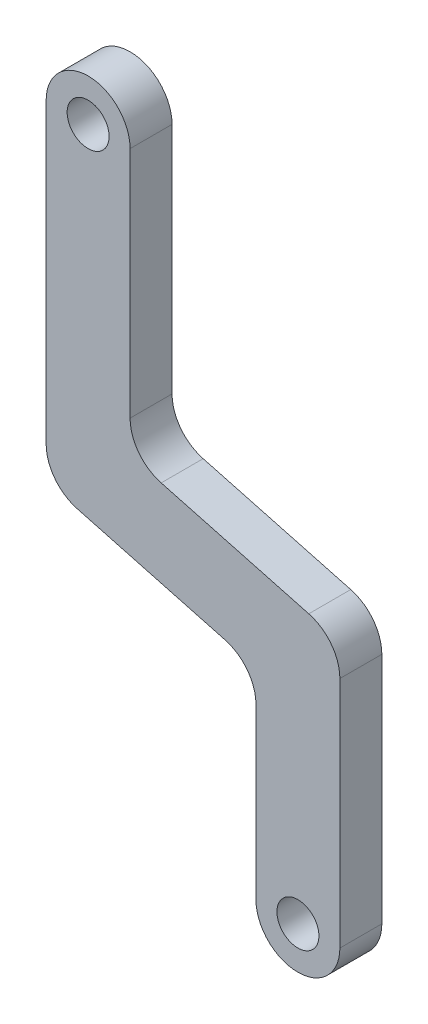
ISO-10303-21;
HEADER;
FILE_DESCRIPTION(('STEP AP214'),'2;1');
FILE_NAME('part.step','',(''),(''),'','','');
FILE_SCHEMA(('AUTOMOTIVE_DESIGN { 1 0 10303 214 1 1 1 1 }'));
ENDSEC;
DATA;
#1=APPLICATION_CONTEXT('core data for automotive mechanical design processes');
#2=APPLICATION_PROTOCOL_DEFINITION('international standard','automotive_design',2000,#1);
#3=PRODUCT_CONTEXT('',#1,'mechanical');
#4=PRODUCT('Part','Part','',(#3));
#5=PRODUCT_RELATED_PRODUCT_CATEGORY('part','',(#4));
#6=PRODUCT_DEFINITION_FORMATION('','',#4);
#7=PRODUCT_DEFINITION_CONTEXT('part definition',#1,'design');
#8=PRODUCT_DEFINITION('design','',#6,#7);
#9=PRODUCT_DEFINITION_SHAPE('','',#8);
#10=(LENGTH_UNIT() NAMED_UNIT(*) SI_UNIT(.MILLI.,.METRE.));
#11=(NAMED_UNIT(*) PLANE_ANGLE_UNIT() SI_UNIT($,.RADIAN.));
#12=(NAMED_UNIT(*) SI_UNIT($,.STERADIAN.) SOLID_ANGLE_UNIT());
#13=UNCERTAINTY_MEASURE_WITH_UNIT(LENGTH_MEASURE(1.E-05),#10,'distance_accuracy_value','');
#14=(GEOMETRIC_REPRESENTATION_CONTEXT(3) GLOBAL_UNCERTAINTY_ASSIGNED_CONTEXT((#13)) GLOBAL_UNIT_ASSIGNED_CONTEXT((#10,
#11,#12)) REPRESENTATION_CONTEXT('',''));
#15=CARTESIAN_POINT('',(0.,0.,0.));
#16=DIRECTION('',(0.,0.,1.));
#17=DIRECTION('',(1.,0.,0.));
#18=AXIS2_PLACEMENT_3D('',#15,#16,#17);
#19=CARTESIAN_POINT('',(-17.5,0.,5.));
#20=DIRECTION('',(-1.,0.,0.));
#21=DIRECTION('',(0.,-1.,0.));
#22=AXIS2_PLACEMENT_3D('',#19,#20,#21);
#23=PLANE('',#22);
#24=DIRECTION('',(0.,1.,0.));
#25=VECTOR('',#24,1.);
#26=CARTESIAN_POINT('',(-17.5,0.,0.));
#27=LINE('',#26,#25);
#28=CARTESIAN_POINT('',(-17.5,35.,0.));
#29=VERTEX_POINT('',#28);
#30=CARTESIAN_POINT('',(-17.5,-0.48727003450576,0.));
#31=VERTEX_POINT('',#30);
#32=EDGE_CURVE('E190',#29,#31,#27,.F.);
#33=ORIENTED_EDGE('',*,*,#32,.T.);
#34=DIRECTION('',(0.,0.,1.));
#35=VECTOR('',#34,1.);
#36=CARTESIAN_POINT('',(-17.5,-0.48727003450576,5.));
#37=LINE('',#36,#35);
#38=CARTESIAN_POINT('',(-17.5,-0.48727003450576,5.));
#39=VERTEX_POINT('',#38);
#40=EDGE_CURVE('E211',#31,#39,#37,.T.);
#41=ORIENTED_EDGE('',*,*,#40,.T.);
#42=DIRECTION('',(0.,-1.,0.));
#43=VECTOR('',#42,1.);
#44=CARTESIAN_POINT('',(-17.5,0.,5.));
#45=LINE('',#44,#43);
#46=CARTESIAN_POINT('',(-17.5,35.,5.));
#47=VERTEX_POINT('',#46);
#48=EDGE_CURVE('E154',#47,#39,#45,.T.);
#49=ORIENTED_EDGE('',*,*,#48,.F.);
#50=DIRECTION('',(0.,0.,1.));
#51=VECTOR('',#50,1.);
#52=CARTESIAN_POINT('',(-17.5,35.,5.));
#53=LINE('',#52,#51);
#54=EDGE_CURVE('E153',#29,#47,#53,.T.);
#55=ORIENTED_EDGE('',*,*,#54,.F.);
#56=EDGE_LOOP('',(#33,#41,#49,#55));
#57=FACE_BOUND('',#56,.T.);
#58=ADVANCED_FACE('F38',(#57),#23,.T.);
#59=CARTESIAN_POINT('',(-2.25325396048631,-8.40925826289068,5.));
#60=DIRECTION('',(-0.258819045102521,-0.965925826289068,0.));
#61=DIRECTION('',(0.965925826289068,-0.258819045102521,0.));
#62=AXIS2_PLACEMENT_3D('',#59,#60,#61);
#63=PLANE('',#62);
#64=DIRECTION('',(0.965925826289068,-0.258819045102521,0.));
#65=VECTOR('',#64,1.);
#66=CARTESIAN_POINT('',(-2.25325396048631,-8.40925826289068,0.));
#67=LINE('',#66,#65);
#68=CARTESIAN_POINT('',(-13.7940952255126,-5.3168991659511,0.));
#69=VERTEX_POINT('',#68);
#70=CARTESIAN_POINT('',(3.79409522551261,-10.0296405936281,0.));
#71=VERTEX_POINT('',#70);
#72=EDGE_CURVE('E187',#69,#71,#67,.T.);
#73=ORIENTED_EDGE('',*,*,#72,.T.);
#74=DIRECTION('',(0.,0.,1.));
#75=VECTOR('',#74,1.);
#76=CARTESIAN_POINT('',(3.7940952255126,-10.0296405936281,5.));
#77=LINE('',#76,#75);
#78=CARTESIAN_POINT('',(3.79409522551261,-10.0296405936281,5.));
#79=VERTEX_POINT('',#78);
#80=EDGE_CURVE('E206',#71,#79,#77,.T.);
#81=ORIENTED_EDGE('',*,*,#80,.T.);
#82=DIRECTION('',(0.965925826289068,-0.258819045102521,0.));
#83=VECTOR('',#82,1.);
#84=CARTESIAN_POINT('',(-2.25325396048631,-8.40925826289068,5.));
#85=LINE('',#84,#83);
#86=CARTESIAN_POINT('',(-13.7940952255126,-5.3168991659511,5.));
#87=VERTEX_POINT('',#86);
#88=EDGE_CURVE('E156',#87,#79,#85,.T.);
#89=ORIENTED_EDGE('',*,*,#88,.F.);
#90=DIRECTION('',(0.,0.,1.));
#91=VECTOR('',#90,1.);
#92=CARTESIAN_POINT('',(-13.7940952255126,-5.3168991659511,5.));
#93=LINE('',#92,#91);
#94=EDGE_CURVE('E203',#87,#69,#93,.F.);
#95=ORIENTED_EDGE('',*,*,#94,.T.);
#96=EDGE_LOOP('',(#73,#81,#89,#95));
#97=FACE_BOUND('',#96,.T.);
#98=ADVANCED_FACE('F244',(#97),#63,.T.);
#99=CARTESIAN_POINT('',(7.5,0.,5.));
#100=DIRECTION('',(-1.,0.,0.));
#101=DIRECTION('',(0.,-1.,0.));
#102=AXIS2_PLACEMENT_3D('',#99,#100,#101);
#103=PLANE('',#102);
#104=DIRECTION('',(0.,-1.,0.));
#105=VECTOR('',#104,1.);
#106=CARTESIAN_POINT('',(7.5,0.,5.));
#107=LINE('',#106,#105);
#108=CARTESIAN_POINT('',(7.5,-14.8592697250734,5.));
#109=VERTEX_POINT('',#108);
#110=CARTESIAN_POINT('',(7.50000000000001,-35.,5.));
#111=VERTEX_POINT('',#110);
#112=EDGE_CURVE('E161',#109,#111,#107,.T.);
#113=ORIENTED_EDGE('',*,*,#112,.F.);
#114=DIRECTION('',(0.,0.,1.));
#115=VECTOR('',#114,1.);
#116=CARTESIAN_POINT('',(7.5,-14.8592697250734,0.));
#117=LINE('',#116,#115);
#118=CARTESIAN_POINT('',(7.5,-14.8592697250734,0.));
#119=VERTEX_POINT('',#118);
#120=EDGE_CURVE('E209',#109,#119,#117,.F.);
#121=ORIENTED_EDGE('',*,*,#120,.T.);
#122=DIRECTION('',(0.,1.,0.));
#123=VECTOR('',#122,1.);
#124=CARTESIAN_POINT('',(7.5,0.,0.));
#125=LINE('',#124,#123);
#126=CARTESIAN_POINT('',(7.50000000000001,-35.,0.));
#127=VERTEX_POINT('',#126);
#128=EDGE_CURVE('E185',#119,#127,#125,.F.);
#129=ORIENTED_EDGE('',*,*,#128,.T.);
#130=DIRECTION('',(0.,0.,1.));
#131=VECTOR('',#130,1.);
#132=CARTESIAN_POINT('',(7.50000000000001,-35.,5.));
#133=LINE('',#132,#131);
#134=EDGE_CURVE('E200',#127,#111,#133,.T.);
#135=ORIENTED_EDGE('',*,*,#134,.T.);
#136=EDGE_LOOP('',(#113,#121,#129,#135));
#137=FACE_BOUND('',#136,.T.);
#138=ADVANCED_FACE('F250',(#137),#103,.T.);
#139=CARTESIAN_POINT('',(12.5,-35.,5.));
#140=DIRECTION('',(0.,0.,1.));
#141=DIRECTION('',(1.,0.,0.));
#142=AXIS2_PLACEMENT_3D('',#139,#140,#141);
#143=CYLINDRICAL_SURFACE('',#142,4.99999999999999);
#144=ORIENTED_EDGE('',*,*,#134,.F.);
#145=CARTESIAN_POINT('',(12.5,-35.,0.));
#146=DIRECTION('',(0.,0.,1.));
#147=DIRECTION('',(1.,0.,0.));
#148=AXIS2_PLACEMENT_3D('',#145,#146,#147);
#149=CIRCLE('',#148,4.99999999999999);
#150=CARTESIAN_POINT('',(17.5,-35.,0.));
#151=VERTEX_POINT('',#150);
#152=EDGE_CURVE('E182',#127,#151,#149,.T.);
#153=ORIENTED_EDGE('',*,*,#152,.T.);
#154=DIRECTION('',(0.,0.,1.));
#155=VECTOR('',#154,1.);
#156=CARTESIAN_POINT('',(17.5,-35.,5.));
#157=LINE('',#156,#155);
#158=CARTESIAN_POINT('',(17.5,-35.,5.));
#159=VERTEX_POINT('',#158);
#160=EDGE_CURVE('E139',#151,#159,#157,.T.);
#161=ORIENTED_EDGE('',*,*,#160,.T.);
#162=CARTESIAN_POINT('',(12.5,-35.,5.));
#163=DIRECTION('',(0.,0.,1.));
#164=DIRECTION('',(1.,0.,0.));
#165=AXIS2_PLACEMENT_3D('',#162,#163,#164);
#166=CIRCLE('',#165,4.99999999999999);
#167=EDGE_CURVE('E163',#111,#159,#166,.T.);
#168=ORIENTED_EDGE('',*,*,#167,.F.);
#169=EDGE_LOOP('',(#144,#153,#161,#168));
#170=FACE_BOUND('',#169,.T.);
#171=ADVANCED_FACE('F254',(#170),#143,.T.);
#172=CARTESIAN_POINT('',(17.5,0.,5.));
#173=DIRECTION('',(-1.,0.,0.));
#174=DIRECTION('',(0.,-1.,0.));
#175=AXIS2_PLACEMENT_3D('',#172,#173,#174);
#176=PLANE('',#175);
#177=DIRECTION('',(0.,1.,0.));
#178=VECTOR('',#177,1.);
#179=CARTESIAN_POINT('',(17.5,0.,0.));
#180=LINE('',#179,#178);
#181=CARTESIAN_POINT('',(17.5,-7.18599984528384,0.));
#182=VERTEX_POINT('',#181);
#183=EDGE_CURVE('E180',#182,#151,#180,.F.);
#184=ORIENTED_EDGE('',*,*,#183,.F.);
#185=DIRECTION('',(0.,0.,-1.));
#186=VECTOR('',#185,1.);
#187=CARTESIAN_POINT('',(17.5,-7.18599984528384,5.));
#188=LINE('',#187,#186);
#189=CARTESIAN_POINT('',(17.5,-7.18599984528384,5.));
#190=VERTEX_POINT('',#189);
#191=EDGE_CURVE('E221',#182,#190,#188,.F.);
#192=ORIENTED_EDGE('',*,*,#191,.T.);
#193=DIRECTION('',(0.,-1.,0.));
#194=VECTOR('',#193,1.);
#195=CARTESIAN_POINT('',(17.5,0.,5.));
#196=LINE('',#195,#194);
#197=EDGE_CURVE('E166',#190,#159,#196,.T.);
#198=ORIENTED_EDGE('',*,*,#197,.T.);
#199=ORIENTED_EDGE('',*,*,#160,.F.);
#200=EDGE_LOOP('',(#184,#192,#198,#199));
#201=FACE_BOUND('',#200,.T.);
#202=ADVANCED_FACE('F258',(#201),#176,.F.);
#203=CARTESIAN_POINT('',(0.334936490538905,1.25,5.));
#204=DIRECTION('',(-0.258819045102521,-0.965925826289068,0.));
#205=DIRECTION('',(0.965925826289068,-0.258819045102521,0.));
#206=AXIS2_PLACEMENT_3D('',#203,#204,#205);
#207=PLANE('',#206);
#208=DIRECTION('',(0.965925826289068,-0.258819045102521,0.));
#209=VECTOR('',#208,1.);
#210=CARTESIAN_POINT('',(0.334936490538905,1.25,5.));
#211=LINE('',#210,#209);
#212=CARTESIAN_POINT('',(-3.79409522551261,2.3563707138385,5.));
#213=VERTEX_POINT('',#212);
#214=CARTESIAN_POINT('',(13.7940952255126,-2.3563707138385,5.));
#215=VERTEX_POINT('',#214);
#216=EDGE_CURVE('E168',#213,#215,#211,.T.);
#217=ORIENTED_EDGE('',*,*,#216,.T.);
#218=DIRECTION('',(0.,0.,-1.));
#219=VECTOR('',#218,1.);
#220=CARTESIAN_POINT('',(13.7940952255126,-2.3563707138385,5.));
#221=LINE('',#220,#219);
#222=CARTESIAN_POINT('',(13.7940952255126,-2.3563707138385,0.));
#223=VERTEX_POINT('',#222);
#224=EDGE_CURVE('E61',#215,#223,#221,.T.);
#225=ORIENTED_EDGE('',*,*,#224,.T.);
#226=DIRECTION('',(0.965925826289068,-0.258819045102521,0.));
#227=VECTOR('',#226,1.);
#228=CARTESIAN_POINT('',(0.334936490538905,1.25,0.));
#229=LINE('',#228,#227);
#230=CARTESIAN_POINT('',(-3.79409522551261,2.3563707138385,0.));
#231=VERTEX_POINT('',#230);
#232=EDGE_CURVE('E177',#231,#223,#229,.T.);
#233=ORIENTED_EDGE('',*,*,#232,.F.);
#234=DIRECTION('',(0.,0.,-1.));
#235=VECTOR('',#234,1.);
#236=CARTESIAN_POINT('',(-3.79409522551261,2.3563707138385,5.));
#237=LINE('',#236,#235);
#238=EDGE_CURVE('E224',#231,#213,#237,.F.);
#239=ORIENTED_EDGE('',*,*,#238,.T.);
#240=EDGE_LOOP('',(#217,#225,#233,#239));
#241=FACE_BOUND('',#240,.T.);
#242=ADVANCED_FACE('F303',(#241),#207,.F.);
#243=CARTESIAN_POINT('',(-7.5,0.,5.));
#244=DIRECTION('',(-1.,0.,0.));
#245=DIRECTION('',(0.,-1.,0.));
#246=AXIS2_PLACEMENT_3D('',#243,#244,#245);
#247=PLANE('',#246);
#248=DIRECTION('',(0.,-1.,0.));
#249=VECTOR('',#248,1.);
#250=CARTESIAN_POINT('',(-7.5,0.,5.));
#251=LINE('',#250,#249);
#252=CARTESIAN_POINT('',(-7.5,35.,5.));
#253=VERTEX_POINT('',#252);
#254=CARTESIAN_POINT('',(-7.5,7.18599984528384,5.));
#255=VERTEX_POINT('',#254);
#256=EDGE_CURVE('E131',#253,#255,#251,.T.);
#257=ORIENTED_EDGE('',*,*,#256,.T.);
#258=DIRECTION('',(0.,0.,-1.));
#259=VECTOR('',#258,1.);
#260=CARTESIAN_POINT('',(-7.5,7.18599984528384,0.));
#261=LINE('',#260,#259);
#262=CARTESIAN_POINT('',(-7.5,7.18599984528384,0.));
#263=VERTEX_POINT('',#262);
#264=EDGE_CURVE('E228',#255,#263,#261,.T.);
#265=ORIENTED_EDGE('',*,*,#264,.T.);
#266=DIRECTION('',(0.,1.,0.));
#267=VECTOR('',#266,1.);
#268=CARTESIAN_POINT('',(-7.5,0.,0.));
#269=LINE('',#268,#267);
#270=CARTESIAN_POINT('',(-7.5,35.,0.));
#271=VERTEX_POINT('',#270);
#272=EDGE_CURVE('E134',#271,#263,#269,.F.);
#273=ORIENTED_EDGE('',*,*,#272,.F.);
#274=DIRECTION('',(0.,0.,1.));
#275=VECTOR('',#274,1.);
#276=CARTESIAN_POINT('',(-7.5,35.,5.));
#277=LINE('',#276,#275);
#278=EDGE_CURVE('E128',#271,#253,#277,.T.);
#279=ORIENTED_EDGE('',*,*,#278,.T.);
#280=EDGE_LOOP('',(#257,#265,#273,#279));
#281=FACE_BOUND('',#280,.T.);
#282=ADVANCED_FACE('F130',(#281),#247,.F.);
#283=CARTESIAN_POINT('',(-12.5,35.,5.));
#284=DIRECTION('',(0.,0.,1.));
#285=DIRECTION('',(1.,0.,0.));
#286=AXIS2_PLACEMENT_3D('',#283,#284,#285);
#287=CYLINDRICAL_SURFACE('',#286,5.00000000000001);
#288=CARTESIAN_POINT('',(-12.5,35.,0.));
#289=DIRECTION('',(0.,0.,1.));
#290=DIRECTION('',(1.,0.,0.));
#291=AXIS2_PLACEMENT_3D('',#288,#289,#290);
#292=CIRCLE('',#291,5.00000000000001);
#293=EDGE_CURVE('E176',#271,#29,#292,.T.);
#294=ORIENTED_EDGE('',*,*,#293,.T.);
#295=ORIENTED_EDGE('',*,*,#54,.T.);
#296=CARTESIAN_POINT('',(-12.5,35.,5.));
#297=DIRECTION('',(0.,0.,1.));
#298=DIRECTION('',(1.,0.,0.));
#299=AXIS2_PLACEMENT_3D('',#296,#297,#298);
#300=CIRCLE('',#299,5.00000000000001);
#301=EDGE_CURVE('E147',#253,#47,#300,.T.);
#302=ORIENTED_EDGE('',*,*,#301,.F.);
#303=ORIENTED_EDGE('',*,*,#278,.F.);
#304=EDGE_LOOP('',(#294,#295,#302,#303));
#305=FACE_BOUND('',#304,.T.);
#306=ADVANCED_FACE('F152',(#305),#287,.T.);
#307=CARTESIAN_POINT('',(12.5,-35.,5.));
#308=DIRECTION('',(0.,0.,1.));
#309=DIRECTION('',(1.,0.,0.));
#310=AXIS2_PLACEMENT_3D('',#307,#308,#309);
#311=CYLINDRICAL_SURFACE('',#310,2.5);
#312=CARTESIAN_POINT('',(12.5,-35.,5.));
#313=DIRECTION('',(0.,0.,1.));
#314=DIRECTION('',(1.,0.,0.));
#315=AXIS2_PLACEMENT_3D('',#312,#313,#314);
#316=CIRCLE('',#315,2.5);
#317=CARTESIAN_POINT('',(15.,-35.,5.));
#318=VERTEX_POINT('',#317);
#319=EDGE_CURVE('E170',#318,#318,#316,.T.);
#320=ORIENTED_EDGE('',*,*,#319,.T.);
#321=EDGE_LOOP('',(#320));
#322=FACE_BOUND('',#321,.T.);
#323=CARTESIAN_POINT('',(12.5,-35.,0.));
#324=DIRECTION('',(0.,0.,1.));
#325=DIRECTION('',(1.,0.,0.));
#326=AXIS2_PLACEMENT_3D('',#323,#324,#325);
#327=CIRCLE('',#326,2.5);
#328=CARTESIAN_POINT('',(15.,-35.,0.));
#329=VERTEX_POINT('',#328);
#330=EDGE_CURVE('E179',#329,#329,#327,.T.);
#331=ORIENTED_EDGE('',*,*,#330,.F.);
#332=EDGE_LOOP('',(#331));
#333=FACE_BOUND('',#332,.T.);
#334=ADVANCED_FACE('F283',(#322,#333),#311,.F.);
#335=CARTESIAN_POINT('',(-12.5,35.,5.));
#336=DIRECTION('',(0.,0.,1.));
#337=DIRECTION('',(1.,0.,0.));
#338=AXIS2_PLACEMENT_3D('',#335,#336,#337);
#339=CYLINDRICAL_SURFACE('',#338,2.5);
#340=CARTESIAN_POINT('',(-12.5,35.,5.));
#341=DIRECTION('',(0.,0.,1.));
#342=DIRECTION('',(1.,0.,0.));
#343=AXIS2_PLACEMENT_3D('',#340,#341,#342);
#344=CIRCLE('',#343,2.5);
#345=CARTESIAN_POINT('',(-10.,35.,5.));
#346=VERTEX_POINT('',#345);
#347=EDGE_CURVE('E140',#346,#346,#344,.T.);
#348=ORIENTED_EDGE('',*,*,#347,.T.);
#349=EDGE_LOOP('',(#348));
#350=FACE_BOUND('',#349,.T.);
#351=CARTESIAN_POINT('',(-12.5,35.,0.));
#352=DIRECTION('',(0.,0.,1.));
#353=DIRECTION('',(1.,0.,0.));
#354=AXIS2_PLACEMENT_3D('',#351,#352,#353);
#355=CIRCLE('',#354,2.5);
#356=CARTESIAN_POINT('',(-10.,35.,0.));
#357=VERTEX_POINT('',#356);
#358=EDGE_CURVE('E150',#357,#357,#355,.T.);
#359=ORIENTED_EDGE('',*,*,#358,.F.);
#360=EDGE_LOOP('',(#359));
#361=FACE_BOUND('',#360,.T.);
#362=ADVANCED_FACE('F286',(#350,#361),#339,.F.);
#363=CARTESIAN_POINT('',(0.,0.,5.));
#364=DIRECTION('',(0.,0.,1.));
#365=DIRECTION('',(1.,0.,0.));
#366=AXIS2_PLACEMENT_3D('',#363,#364,#365);
#367=PLANE('',#366);
#368=ORIENTED_EDGE('',*,*,#48,.T.);
#369=CARTESIAN_POINT('',(-12.5,-0.487270034505759,5.));
#370=DIRECTION('',(0.,0.,1.));
#371=DIRECTION('',(1.,0.,0.));
#372=AXIS2_PLACEMENT_3D('',#369,#370,#371);
#373=CIRCLE('',#372,5.);
#374=EDGE_CURVE('E216',#39,#87,#373,.T.);
#375=ORIENTED_EDGE('',*,*,#374,.T.);
#376=ORIENTED_EDGE('',*,*,#88,.T.);
#377=CARTESIAN_POINT('',(2.5,-14.8592697250734,5.));
#378=DIRECTION('',(0.,0.,1.));
#379=DIRECTION('',(1.,0.,0.));
#380=AXIS2_PLACEMENT_3D('',#377,#378,#379);
#381=CIRCLE('',#380,5.);
#382=EDGE_CURVE('E230',#79,#109,#381,.F.);
#383=ORIENTED_EDGE('',*,*,#382,.T.);
#384=ORIENTED_EDGE('',*,*,#112,.T.);
#385=ORIENTED_EDGE('',*,*,#167,.T.);
#386=ORIENTED_EDGE('',*,*,#197,.F.);
#387=CARTESIAN_POINT('',(12.5,-7.18599984528384,5.));
#388=DIRECTION('',(0.,0.,1.));
#389=DIRECTION('',(1.,0.,0.));
#390=AXIS2_PLACEMENT_3D('',#387,#388,#389);
#391=CIRCLE('',#390,5.);
#392=EDGE_CURVE('E214',#190,#215,#391,.T.);
#393=ORIENTED_EDGE('',*,*,#392,.T.);
#394=ORIENTED_EDGE('',*,*,#216,.F.);
#395=CARTESIAN_POINT('',(-2.5,7.18599984528384,5.));
#396=DIRECTION('',(0.,0.,1.));
#397=DIRECTION('',(1.,0.,0.));
#398=AXIS2_PLACEMENT_3D('',#395,#396,#397);
#399=CIRCLE('',#398,5.);
#400=EDGE_CURVE('E46',#213,#255,#399,.F.);
#401=ORIENTED_EDGE('',*,*,#400,.T.);
#402=ORIENTED_EDGE('',*,*,#256,.F.);
#403=ORIENTED_EDGE('',*,*,#301,.T.);
#404=EDGE_LOOP('',(#368,#375,#376,#383,#384,#385,#386,#393,#394,#401,#402,#403));
#405=FACE_BOUND('',#404,.T.);
#406=ORIENTED_EDGE('',*,*,#319,.F.);
#407=EDGE_LOOP('',(#406));
#408=FACE_BOUND('',#407,.T.);
#409=ORIENTED_EDGE('',*,*,#347,.F.);
#410=EDGE_LOOP('',(#409));
#411=FACE_BOUND('',#410,.T.);
#412=ADVANCED_FACE('F145',(#405,#408,#411),#367,.T.);
#413=CARTESIAN_POINT('',(0.,0.,0.));
#414=DIRECTION('',(0.,0.,1.));
#415=DIRECTION('',(1.,0.,0.));
#416=AXIS2_PLACEMENT_3D('',#413,#414,#415);
#417=PLANE('',#416);
#418=ORIENTED_EDGE('',*,*,#72,.F.);
#419=CARTESIAN_POINT('',(-12.5,-0.487270034505759,0.));
#420=DIRECTION('',(0.,0.,1.));
#421=DIRECTION('',(1.,0.,0.));
#422=AXIS2_PLACEMENT_3D('',#419,#420,#421);
#423=CIRCLE('',#422,5.);
#424=EDGE_CURVE('E219',#69,#31,#423,.F.);
#425=ORIENTED_EDGE('',*,*,#424,.T.);
#426=ORIENTED_EDGE('',*,*,#32,.F.);
#427=ORIENTED_EDGE('',*,*,#293,.F.);
#428=ORIENTED_EDGE('',*,*,#272,.T.);
#429=CARTESIAN_POINT('',(-2.5,7.18599984528384,0.));
#430=DIRECTION('',(0.,0.,1.));
#431=DIRECTION('',(1.,0.,0.));
#432=AXIS2_PLACEMENT_3D('',#429,#430,#431);
#433=CIRCLE('',#432,5.);
#434=EDGE_CURVE('E11',#263,#231,#433,.T.);
#435=ORIENTED_EDGE('',*,*,#434,.T.);
#436=ORIENTED_EDGE('',*,*,#232,.T.);
#437=CARTESIAN_POINT('',(12.5,-7.18599984528384,0.));
#438=DIRECTION('',(0.,0.,1.));
#439=DIRECTION('',(1.,0.,0.));
#440=AXIS2_PLACEMENT_3D('',#437,#438,#439);
#441=CIRCLE('',#440,5.);
#442=EDGE_CURVE('E53',#223,#182,#441,.F.);
#443=ORIENTED_EDGE('',*,*,#442,.T.);
#444=ORIENTED_EDGE('',*,*,#183,.T.);
#445=ORIENTED_EDGE('',*,*,#152,.F.);
#446=ORIENTED_EDGE('',*,*,#128,.F.);
#447=CARTESIAN_POINT('',(2.5,-14.8592697250734,0.));
#448=DIRECTION('',(0.,0.,1.));
#449=DIRECTION('',(1.,0.,0.));
#450=AXIS2_PLACEMENT_3D('',#447,#448,#449);
#451=CIRCLE('',#450,5.);
#452=EDGE_CURVE('E232',#119,#71,#451,.T.);
#453=ORIENTED_EDGE('',*,*,#452,.T.);
#454=EDGE_LOOP('',(#418,#425,#426,#427,#428,#435,#436,#443,#444,#445,#446,#453));
#455=FACE_BOUND('',#454,.T.);
#456=ORIENTED_EDGE('',*,*,#330,.T.);
#457=EDGE_LOOP('',(#456));
#458=FACE_BOUND('',#457,.T.);
#459=ORIENTED_EDGE('',*,*,#358,.T.);
#460=EDGE_LOOP('',(#459));
#461=FACE_BOUND('',#460,.T.);
#462=ADVANCED_FACE('F236',(#455,#458,#461),#417,.F.);
#463=CARTESIAN_POINT('',(2.5,-14.8592697250734,5.));
#464=DIRECTION('',(0.,0.,-1.));
#465=DIRECTION('',(-1.,0.,0.));
#466=AXIS2_PLACEMENT_3D('',#463,#464,#465);
#467=CYLINDRICAL_SURFACE('',#466,5.);
#468=ORIENTED_EDGE('',*,*,#452,.F.);
#469=ORIENTED_EDGE('',*,*,#120,.F.);
#470=ORIENTED_EDGE('',*,*,#382,.F.);
#471=ORIENTED_EDGE('',*,*,#80,.F.);
#472=EDGE_LOOP('',(#468,#469,#470,#471));
#473=FACE_BOUND('',#472,.T.);
#474=ADVANCED_FACE('F247',(#473),#467,.F.);
#475=CARTESIAN_POINT('',(-12.5,-0.487270034505759,5.));
#476=DIRECTION('',(0.,0.,1.));
#477=DIRECTION('',(1.,0.,0.));
#478=AXIS2_PLACEMENT_3D('',#475,#476,#477);
#479=CYLINDRICAL_SURFACE('',#478,5.);
#480=ORIENTED_EDGE('',*,*,#424,.F.);
#481=ORIENTED_EDGE('',*,*,#94,.F.);
#482=ORIENTED_EDGE('',*,*,#374,.F.);
#483=ORIENTED_EDGE('',*,*,#40,.F.);
#484=EDGE_LOOP('',(#480,#481,#482,#483));
#485=FACE_BOUND('',#484,.T.);
#486=ADVANCED_FACE('F263',(#485),#479,.T.);
#487=CARTESIAN_POINT('',(12.5,-7.18599984528384,5.));
#488=DIRECTION('',(0.,0.,1.));
#489=DIRECTION('',(1.,0.,0.));
#490=AXIS2_PLACEMENT_3D('',#487,#488,#489);
#491=CYLINDRICAL_SURFACE('',#490,5.);
#492=ORIENTED_EDGE('',*,*,#442,.F.);
#493=ORIENTED_EDGE('',*,*,#224,.F.);
#494=ORIENTED_EDGE('',*,*,#392,.F.);
#495=ORIENTED_EDGE('',*,*,#191,.F.);
#496=EDGE_LOOP('',(#492,#493,#494,#495));
#497=FACE_BOUND('',#496,.T.);
#498=ADVANCED_FACE('F261',(#497),#491,.T.);
#499=CARTESIAN_POINT('',(-2.5,7.18599984528384,5.));
#500=DIRECTION('',(0.,0.,-1.));
#501=DIRECTION('',(-1.,0.,0.));
#502=AXIS2_PLACEMENT_3D('',#499,#500,#501);
#503=CYLINDRICAL_SURFACE('',#502,5.);
#504=ORIENTED_EDGE('',*,*,#434,.F.);
#505=ORIENTED_EDGE('',*,*,#264,.F.);
#506=ORIENTED_EDGE('',*,*,#400,.F.);
#507=ORIENTED_EDGE('',*,*,#238,.F.);
#508=EDGE_LOOP('',(#504,#505,#506,#507));
#509=FACE_BOUND('',#508,.T.);
#510=ADVANCED_FACE('F40',(#509),#503,.F.);
#511=CLOSED_SHELL('',(#58,#98,#138,#171,#202,#242,#282,#306,#334,#362,#412,#462,#474,#486,#498,#510));
#512=MANIFOLD_SOLID_BREP('B2',#511);
#513=ADVANCED_BREP_SHAPE_REPRESENTATION('',(#18,#512),#14);
#514=SHAPE_DEFINITION_REPRESENTATION(#9,#513);
ENDSEC;
END-ISO-10303-21;
